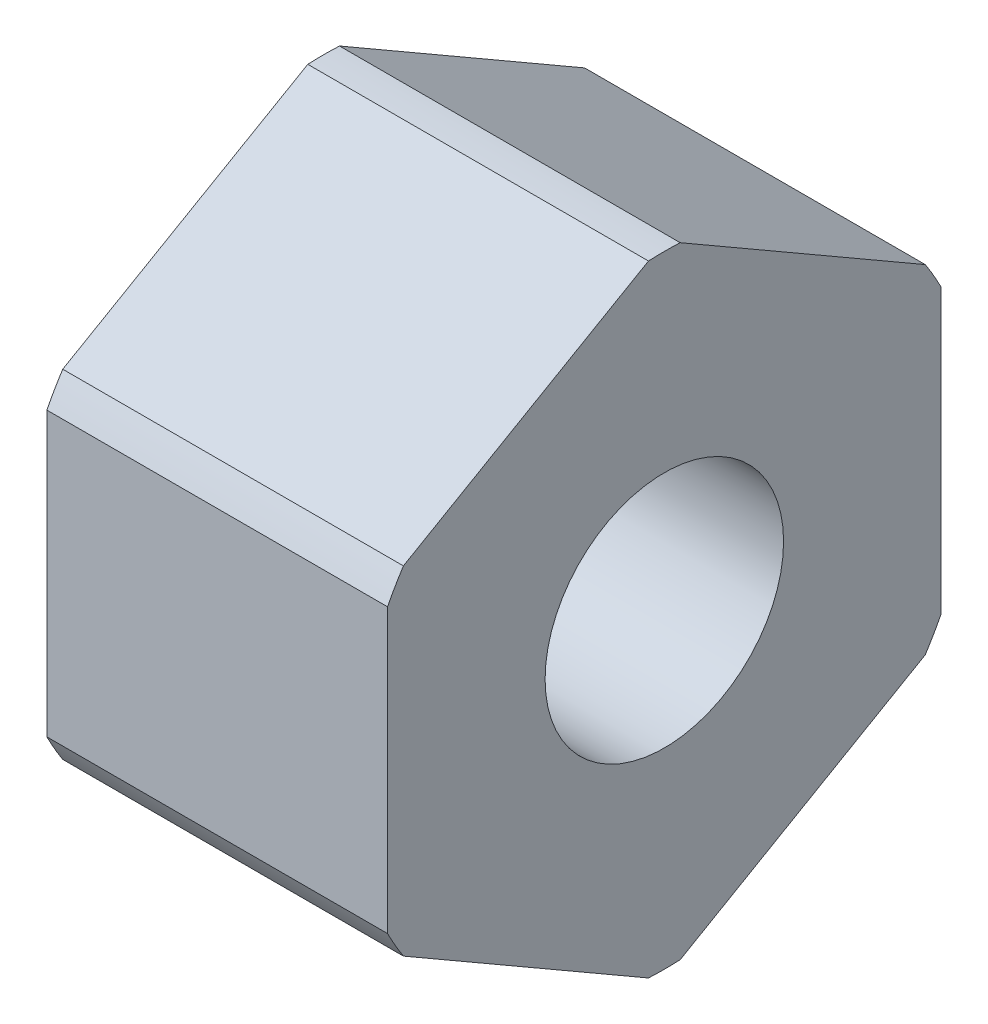
ISO-10303-21;
HEADER;
FILE_DESCRIPTION(('STEP AP214'),'2;1');
FILE_NAME('part.step','',(''),(''),'','','');
FILE_SCHEMA(('AUTOMOTIVE_DESIGN { 1 0 10303 214 1 1 1 1 }'));
ENDSEC;
DATA;
#1=APPLICATION_CONTEXT('core data for automotive mechanical design processes');
#2=APPLICATION_PROTOCOL_DEFINITION('international standard','automotive_design',2000,#1);
#3=PRODUCT_CONTEXT('',#1,'mechanical');
#4=PRODUCT('Part','Part','',(#3));
#5=PRODUCT_RELATED_PRODUCT_CATEGORY('part','',(#4));
#6=PRODUCT_DEFINITION_FORMATION('','',#4);
#7=PRODUCT_DEFINITION_CONTEXT('part definition',#1,'design');
#8=PRODUCT_DEFINITION('design','',#6,#7);
#9=PRODUCT_DEFINITION_SHAPE('','',#8);
#10=(LENGTH_UNIT() NAMED_UNIT(*) SI_UNIT(.MILLI.,.METRE.));
#11=(NAMED_UNIT(*) PLANE_ANGLE_UNIT() SI_UNIT($,.RADIAN.));
#12=(NAMED_UNIT(*) SI_UNIT($,.STERADIAN.) SOLID_ANGLE_UNIT());
#13=UNCERTAINTY_MEASURE_WITH_UNIT(LENGTH_MEASURE(1.E-05),#10,'distance_accuracy_value','');
#14=(GEOMETRIC_REPRESENTATION_CONTEXT(3) GLOBAL_UNCERTAINTY_ASSIGNED_CONTEXT((#13)) GLOBAL_UNIT_ASSIGNED_CONTEXT((#10,
#11,#12)) REPRESENTATION_CONTEXT('',''));
#15=CARTESIAN_POINT('',(0.,0.,0.));
#16=DIRECTION('',(0.,0.,1.));
#17=DIRECTION('',(1.,0.,0.));
#18=AXIS2_PLACEMENT_3D('',#15,#16,#17);
#19=CARTESIAN_POINT('',(0.,1.4,0.));
#20=DIRECTION('',(-1.,0.,0.));
#21=DIRECTION('',(0.,0.,1.));
#22=AXIS2_PLACEMENT_3D('',#19,#20,#21);
#23=PLANE('',#22);
#24=CARTESIAN_POINT('',(0.,0.,0.));
#25=DIRECTION('',(-1.,0.,0.));
#26=DIRECTION('',(0.,0.,1.));
#27=AXIS2_PLACEMENT_3D('',#24,#25,#26);
#28=CIRCLE('',#27,1.4);
#29=CARTESIAN_POINT('',(0.,0.,1.4));
#30=VERTEX_POINT('',#29);
#31=EDGE_CURVE('E136',#30,#30,#28,.T.);
#32=ORIENTED_EDGE('',*,*,#31,.T.);
#33=EDGE_LOOP('',(#32));
#34=FACE_BOUND('',#33,.T.);
#35=DIRECTION('',(0.,0.5,-0.866025403784439));
#36=VECTOR('',#35,1.);
#37=CARTESIAN_POINT('',(0.,3.16458256229943,1.01878221735089));
#38=LINE('',#37,#36);
#39=CARTESIAN_POINT('',(0.,1.98392017600762,3.06374945699382));
#40=VERTEX_POINT('',#39);
#41=CARTESIAN_POINT('',(0.,3.64524494859123,0.186250543006183));
#42=VERTEX_POINT('',#41);
#43=EDGE_CURVE('E202',#40,#42,#38,.T.);
#44=ORIENTED_EDGE('',*,*,#43,.F.);
#45=CARTESIAN_POINT('',(0.,0.,0.));
#46=DIRECTION('',(-1.,0.,0.));
#47=DIRECTION('',(0.,0.,1.));
#48=AXIS2_PLACEMENT_3D('',#45,#46,#47);
#49=CIRCLE('',#48,3.65);
#50=CARTESIAN_POINT('',(0.,1.66132477258362,3.25));
#51=VERTEX_POINT('',#50);
#52=EDGE_CURVE('E161',#51,#40,#49,.T.);
#53=ORIENTED_EDGE('',*,*,#52,.F.);
#54=DIRECTION('',(0.,1.,0.));
#55=VECTOR('',#54,1.);
#56=CARTESIAN_POINT('',(0.,1.4,3.25));
#57=LINE('',#56,#55);
#58=CARTESIAN_POINT('',(0.,-1.66132477258362,3.25));
#59=VERTEX_POINT('',#58);
#60=EDGE_CURVE('E185',#59,#51,#57,.T.);
#61=ORIENTED_EDGE('',*,*,#60,.F.);
#62=CARTESIAN_POINT('',(0.,-1.98392017600762,3.06374945699382));
#63=VERTEX_POINT('',#62);
#64=EDGE_CURVE('E154',#63,#59,#49,.T.);
#65=ORIENTED_EDGE('',*,*,#64,.F.);
#66=DIRECTION('',(0.,0.5,0.866025403784439));
#67=VECTOR('',#66,1.);
#68=CARTESIAN_POINT('',(0.,-2.46458256229942,2.23121778264911));
#69=LINE('',#68,#67);
#70=CARTESIAN_POINT('',(0.,-3.64524494859123,0.186250543006183));
#71=VERTEX_POINT('',#70);
#72=EDGE_CURVE('E209',#71,#63,#69,.T.);
#73=ORIENTED_EDGE('',*,*,#72,.F.);
#74=CARTESIAN_POINT('',(0.,-3.64524494859123,-0.186250543006181));
#75=VERTEX_POINT('',#74);
#76=EDGE_CURVE('E237',#75,#71,#49,.T.);
#77=ORIENTED_EDGE('',*,*,#76,.F.);
#78=DIRECTION('',(0.,-0.5,0.866025403784439));
#79=VECTOR('',#78,1.);
#80=CARTESIAN_POINT('',(0.,-2.46458256229943,-2.23121778264911));
#81=LINE('',#80,#79);
#82=CARTESIAN_POINT('',(0.,-1.98392017600762,-3.06374945699381));
#83=VERTEX_POINT('',#82);
#84=EDGE_CURVE('E214',#83,#75,#81,.T.);
#85=ORIENTED_EDGE('',*,*,#84,.F.);
#86=CARTESIAN_POINT('',(0.,-1.66132477258362,-3.25));
#87=VERTEX_POINT('',#86);
#88=EDGE_CURVE('E235',#87,#83,#49,.T.);
#89=ORIENTED_EDGE('',*,*,#88,.F.);
#90=DIRECTION('',(0.,-1.,0.));
#91=VECTOR('',#90,1.);
#92=CARTESIAN_POINT('',(0.,1.4,-3.25));
#93=LINE('',#92,#91);
#94=CARTESIAN_POINT('',(0.,1.66132477258362,-3.25));
#95=VERTEX_POINT('',#94);
#96=EDGE_CURVE('E220',#95,#87,#93,.T.);
#97=ORIENTED_EDGE('',*,*,#96,.F.);
#98=CARTESIAN_POINT('',(0.,1.98392017600762,-3.06374945699382));
#99=VERTEX_POINT('',#98);
#100=EDGE_CURVE('E231',#99,#95,#49,.T.);
#101=ORIENTED_EDGE('',*,*,#100,.F.);
#102=DIRECTION('',(0.,-0.5,-0.866025403784439));
#103=VECTOR('',#102,1.);
#104=CARTESIAN_POINT('',(0.,3.16458256229943,-1.01878221735089));
#105=LINE('',#104,#103);
#106=CARTESIAN_POINT('',(0.,3.64524494859123,-0.186250543006185));
#107=VERTEX_POINT('',#106);
#108=EDGE_CURVE('E146',#107,#99,#105,.T.);
#109=ORIENTED_EDGE('',*,*,#108,.F.);
#110=EDGE_CURVE('E145',#42,#107,#49,.T.);
#111=ORIENTED_EDGE('',*,*,#110,.F.);
#112=EDGE_LOOP('',(#44,#53,#61,#65,#73,#77,#85,#89,#97,#101,#109,#111));
#113=FACE_BOUND('',#112,.T.);
#114=ADVANCED_FACE('F37',(#34,#113),#23,.F.);
#115=CARTESIAN_POINT('',(-9.40540540540541,0.,0.));
#116=DIRECTION('',(-1.,0.,0.));
#117=DIRECTION('',(0.,0.,1.));
#118=AXIS2_PLACEMENT_3D('',#115,#116,#117);
#119=CYLINDRICAL_SURFACE('',#118,3.65);
#120=DIRECTION('',(-1.,0.,0.));
#121=VECTOR('',#120,1.);
#122=CARTESIAN_POINT('',(-9.40540540540541,3.64524494859123,0.186250543006181));
#123=LINE('',#122,#121);
#124=CARTESIAN_POINT('',(-4.,3.64524494859123,0.186250543006182));
#125=VERTEX_POINT('',#124);
#126=EDGE_CURVE('E198',#42,#125,#123,.T.);
#127=ORIENTED_EDGE('',*,*,#126,.F.);
#128=ORIENTED_EDGE('',*,*,#110,.T.);
#129=DIRECTION('',(-1.,0.,0.));
#130=VECTOR('',#129,1.);
#131=CARTESIAN_POINT('',(-9.40540540540541,3.64524494859123,-0.186250543006185));
#132=LINE('',#131,#130);
#133=CARTESIAN_POINT('',(-4.,3.64524494859123,-0.186250543006186));
#134=VERTEX_POINT('',#133);
#135=EDGE_CURVE('E127',#134,#107,#132,.F.);
#136=ORIENTED_EDGE('',*,*,#135,.F.);
#137=CARTESIAN_POINT('',(-4.,0.,0.));
#138=DIRECTION('',(-1.,0.,0.));
#139=DIRECTION('',(0.,0.,1.));
#140=AXIS2_PLACEMENT_3D('',#137,#138,#139);
#141=CIRCLE('',#140,3.65);
#142=EDGE_CURVE('E143',#125,#134,#141,.T.);
#143=ORIENTED_EDGE('',*,*,#142,.F.);
#144=EDGE_LOOP('',(#127,#128,#136,#143));
#145=FACE_BOUND('',#144,.T.);
#146=ADVANCED_FACE('F142',(#145),#119,.T.);
#147=DIRECTION('',(-1.,0.,0.));
#148=VECTOR('',#147,1.);
#149=CARTESIAN_POINT('',(-9.40540540540541,1.98392017600762,3.06374945699382));
#150=LINE('',#149,#148);
#151=CARTESIAN_POINT('',(-4.,1.98392017600762,3.06374945699381));
#152=VERTEX_POINT('',#151);
#153=EDGE_CURVE('E204',#152,#40,#150,.F.);
#154=ORIENTED_EDGE('',*,*,#153,.F.);
#155=CARTESIAN_POINT('',(-4.,1.66132477258362,3.25));
#156=VERTEX_POINT('',#155);
#157=EDGE_CURVE('E151',#156,#152,#141,.T.);
#158=ORIENTED_EDGE('',*,*,#157,.F.);
#159=DIRECTION('',(-1.,0.,0.));
#160=VECTOR('',#159,1.);
#161=CARTESIAN_POINT('',(-9.40540540540541,1.66132477258362,3.25));
#162=LINE('',#161,#160);
#163=EDGE_CURVE('E177',#51,#156,#162,.T.);
#164=ORIENTED_EDGE('',*,*,#163,.F.);
#165=ORIENTED_EDGE('',*,*,#52,.T.);
#166=EDGE_LOOP('',(#154,#158,#164,#165));
#167=FACE_BOUND('',#166,.T.);
#168=ADVANCED_FACE('F266',(#167),#119,.T.);
#169=DIRECTION('',(-1.,0.,0.));
#170=VECTOR('',#169,1.);
#171=CARTESIAN_POINT('',(-9.40540540540541,-1.66132477258362,3.25));
#172=LINE('',#171,#170);
#173=CARTESIAN_POINT('',(-4.,-1.66132477258362,3.25));
#174=VERTEX_POINT('',#173);
#175=EDGE_CURVE('E174',#174,#59,#172,.F.);
#176=ORIENTED_EDGE('',*,*,#175,.F.);
#177=CARTESIAN_POINT('',(-4.,-1.98392017600762,3.06374945699382));
#178=VERTEX_POINT('',#177);
#179=EDGE_CURVE('E155',#178,#174,#141,.T.);
#180=ORIENTED_EDGE('',*,*,#179,.F.);
#181=DIRECTION('',(-1.,0.,0.));
#182=VECTOR('',#181,1.);
#183=CARTESIAN_POINT('',(-9.40540540540541,-1.98392017600762,3.06374945699382));
#184=LINE('',#183,#182);
#185=EDGE_CURVE('E52',#63,#178,#184,.T.);
#186=ORIENTED_EDGE('',*,*,#185,.F.);
#187=ORIENTED_EDGE('',*,*,#64,.T.);
#188=EDGE_LOOP('',(#176,#180,#186,#187));
#189=FACE_BOUND('',#188,.T.);
#190=ADVANCED_FACE('F183',(#189),#119,.T.);
#191=DIRECTION('',(-1.,0.,0.));
#192=VECTOR('',#191,1.);
#193=CARTESIAN_POINT('',(-9.40540540540541,-3.64524494859123,0.186250543006183));
#194=LINE('',#193,#192);
#195=CARTESIAN_POINT('',(-4.,-3.64524494859123,0.186250543006185));
#196=VERTEX_POINT('',#195);
#197=EDGE_CURVE('E211',#196,#71,#194,.F.);
#198=ORIENTED_EDGE('',*,*,#197,.F.);
#199=CARTESIAN_POINT('',(-4.,-3.64524494859123,-0.186250543006183));
#200=VERTEX_POINT('',#199);
#201=EDGE_CURVE('E188',#200,#196,#141,.T.);
#202=ORIENTED_EDGE('',*,*,#201,.F.);
#203=DIRECTION('',(-1.,0.,0.));
#204=VECTOR('',#203,1.);
#205=CARTESIAN_POINT('',(-9.40540540540541,-3.64524494859123,-0.186250543006185));
#206=LINE('',#205,#204);
#207=EDGE_CURVE('E60',#75,#200,#206,.T.);
#208=ORIENTED_EDGE('',*,*,#207,.F.);
#209=ORIENTED_EDGE('',*,*,#76,.T.);
#210=EDGE_LOOP('',(#198,#202,#208,#209));
#211=FACE_BOUND('',#210,.T.);
#212=ADVANCED_FACE('F245',(#211),#119,.T.);
#213=DIRECTION('',(-1.,0.,0.));
#214=VECTOR('',#213,1.);
#215=CARTESIAN_POINT('',(-9.40540540540541,-1.98392017600762,-3.06374945699381));
#216=LINE('',#215,#214);
#217=CARTESIAN_POINT('',(-4.,-1.98392017600762,-3.06374945699382));
#218=VERTEX_POINT('',#217);
#219=EDGE_CURVE('E216',#218,#83,#216,.F.);
#220=ORIENTED_EDGE('',*,*,#219,.F.);
#221=CARTESIAN_POINT('',(-4.,-1.66132477258362,-3.25));
#222=VERTEX_POINT('',#221);
#223=EDGE_CURVE('E156',#222,#218,#141,.T.);
#224=ORIENTED_EDGE('',*,*,#223,.F.);
#225=DIRECTION('',(-1.,0.,0.));
#226=VECTOR('',#225,1.);
#227=CARTESIAN_POINT('',(-9.40540540540541,-1.66132477258362,-3.25));
#228=LINE('',#227,#226);
#229=EDGE_CURVE('E218',#87,#222,#228,.T.);
#230=ORIENTED_EDGE('',*,*,#229,.F.);
#231=ORIENTED_EDGE('',*,*,#88,.T.);
#232=EDGE_LOOP('',(#220,#224,#230,#231));
#233=FACE_BOUND('',#232,.T.);
#234=ADVANCED_FACE('F292',(#233),#119,.T.);
#235=DIRECTION('',(-1.,0.,0.));
#236=VECTOR('',#235,1.);
#237=CARTESIAN_POINT('',(-9.40540540540541,1.66132477258362,-3.25));
#238=LINE('',#237,#236);
#239=CARTESIAN_POINT('',(-4.,1.66132477258361,-3.25));
#240=VERTEX_POINT('',#239);
#241=EDGE_CURVE('E222',#240,#95,#238,.F.);
#242=ORIENTED_EDGE('',*,*,#241,.F.);
#243=CARTESIAN_POINT('',(-4.,1.98392017600762,-3.06374945699382));
#244=VERTEX_POINT('',#243);
#245=EDGE_CURVE('E152',#244,#240,#141,.T.);
#246=ORIENTED_EDGE('',*,*,#245,.F.);
#247=DIRECTION('',(-1.,0.,0.));
#248=VECTOR('',#247,1.);
#249=CARTESIAN_POINT('',(-9.40540540540541,1.98392017600762,-3.06374945699382));
#250=LINE('',#249,#248);
#251=EDGE_CURVE('E130',#99,#244,#250,.T.);
#252=ORIENTED_EDGE('',*,*,#251,.F.);
#253=ORIENTED_EDGE('',*,*,#100,.T.);
#254=EDGE_LOOP('',(#242,#246,#252,#253));
#255=FACE_BOUND('',#254,.T.);
#256=ADVANCED_FACE('F230',(#255),#119,.T.);
#257=CARTESIAN_POINT('',(-4.,3.65,0.));
#258=DIRECTION('',(1.,0.,0.));
#259=DIRECTION('',(0.,0.,-1.));
#260=AXIS2_PLACEMENT_3D('',#257,#258,#259);
#261=PLANE('',#260);
#262=CARTESIAN_POINT('',(-4.,0.,0.));
#263=DIRECTION('',(-1.,0.,0.));
#264=DIRECTION('',(0.,0.,1.));
#265=AXIS2_PLACEMENT_3D('',#262,#263,#264);
#266=CIRCLE('',#265,2.1);
#267=CARTESIAN_POINT('',(-4.,0.,2.1));
#268=VERTEX_POINT('',#267);
#269=EDGE_CURVE('E159',#268,#268,#266,.T.);
#270=ORIENTED_EDGE('',*,*,#269,.F.);
#271=EDGE_LOOP('',(#270));
#272=FACE_BOUND('',#271,.T.);
#273=DIRECTION('',(0.,-0.5,0.866025403784439));
#274=VECTOR('',#273,1.);
#275=CARTESIAN_POINT('',(-4.,3.72708256229942,0.044503638093399));
#276=LINE('',#275,#274);
#277=EDGE_CURVE('E12',#125,#152,#276,.T.);
#278=ORIENTED_EDGE('',*,*,#277,.F.);
#279=ORIENTED_EDGE('',*,*,#142,.T.);
#280=DIRECTION('',(0.,0.5,0.866025403784439));
#281=VECTOR('',#280,1.);
#282=CARTESIAN_POINT('',(-4.,3.72708256229943,-0.0445036380933998));
#283=LINE('',#282,#281);
#284=EDGE_CURVE('E124',#244,#134,#283,.T.);
#285=ORIENTED_EDGE('',*,*,#284,.F.);
#286=ORIENTED_EDGE('',*,*,#245,.T.);
#287=DIRECTION('',(0.,1.,0.));
#288=VECTOR('',#287,1.);
#289=CARTESIAN_POINT('',(-4.,3.65,-3.25));
#290=LINE('',#289,#288);
#291=EDGE_CURVE('E135',#222,#240,#290,.T.);
#292=ORIENTED_EDGE('',*,*,#291,.F.);
#293=ORIENTED_EDGE('',*,*,#223,.T.);
#294=DIRECTION('',(0.,0.5,-0.866025403784439));
#295=VECTOR('',#294,1.);
#296=CARTESIAN_POINT('',(-4.,-1.90208256229943,-3.2054963619066));
#297=LINE('',#296,#295);
#298=EDGE_CURVE('E167',#200,#218,#297,.T.);
#299=ORIENTED_EDGE('',*,*,#298,.F.);
#300=ORIENTED_EDGE('',*,*,#201,.T.);
#301=DIRECTION('',(0.,-0.5,-0.866025403784439));
#302=VECTOR('',#301,1.);
#303=CARTESIAN_POINT('',(-4.,-1.90208256229943,3.2054963619066));
#304=LINE('',#303,#302);
#305=EDGE_CURVE('E169',#178,#196,#304,.T.);
#306=ORIENTED_EDGE('',*,*,#305,.F.);
#307=ORIENTED_EDGE('',*,*,#179,.T.);
#308=DIRECTION('',(0.,-1.,0.));
#309=VECTOR('',#308,1.);
#310=CARTESIAN_POINT('',(-4.,3.65,3.25));
#311=LINE('',#310,#309);
#312=EDGE_CURVE('E45',#156,#174,#311,.T.);
#313=ORIENTED_EDGE('',*,*,#312,.F.);
#314=ORIENTED_EDGE('',*,*,#157,.T.);
#315=EDGE_LOOP('',(#278,#279,#285,#286,#292,#293,#299,#300,#306,#307,#313,#314));
#316=FACE_BOUND('',#315,.T.);
#317=ADVANCED_FACE('F149',(#272,#316),#261,.F.);
#318=CARTESIAN_POINT('',(-9.40540540540541,0.,0.));
#319=DIRECTION('',(-1.,0.,0.));
#320=DIRECTION('',(0.,0.,1.));
#321=AXIS2_PLACEMENT_3D('',#318,#319,#320);
#322=CYLINDRICAL_SURFACE('',#321,1.4);
#323=ORIENTED_EDGE('',*,*,#31,.F.);
#324=EDGE_LOOP('',(#323));
#325=FACE_BOUND('',#324,.T.);
#326=CARTESIAN_POINT('',(-3.,0.,0.));
#327=DIRECTION('',(-1.,0.,0.));
#328=DIRECTION('',(0.,0.,1.));
#329=AXIS2_PLACEMENT_3D('',#326,#327,#328);
#330=CIRCLE('',#329,1.4);
#331=CARTESIAN_POINT('',(-3.,0.,1.4));
#332=VERTEX_POINT('',#331);
#333=EDGE_CURVE('E194',#332,#332,#330,.T.);
#334=ORIENTED_EDGE('',*,*,#333,.T.);
#335=EDGE_LOOP('',(#334));
#336=FACE_BOUND('',#335,.T.);
#337=ADVANCED_FACE('F39',(#325,#336),#322,.F.);
#338=CARTESIAN_POINT('',(-9.40540540540541,0.,0.));
#339=DIRECTION('',(-1.,0.,0.));
#340=DIRECTION('',(0.,0.,1.));
#341=AXIS2_PLACEMENT_3D('',#338,#339,#340);
#342=CYLINDRICAL_SURFACE('',#341,2.1);
#343=CARTESIAN_POINT('',(-3.,0.,0.));
#344=DIRECTION('',(-1.,0.,0.));
#345=DIRECTION('',(0.,0.,1.));
#346=AXIS2_PLACEMENT_3D('',#343,#344,#345);
#347=CIRCLE('',#346,2.1);
#348=CARTESIAN_POINT('',(-3.,0.,2.1));
#349=VERTEX_POINT('',#348);
#350=EDGE_CURVE('E190',#349,#349,#347,.T.);
#351=ORIENTED_EDGE('',*,*,#350,.F.);
#352=EDGE_LOOP('',(#351));
#353=FACE_BOUND('',#352,.T.);
#354=ORIENTED_EDGE('',*,*,#269,.T.);
#355=EDGE_LOOP('',(#354));
#356=FACE_BOUND('',#355,.T.);
#357=ADVANCED_FACE('F272',(#353,#356),#342,.F.);
#358=CARTESIAN_POINT('',(-3.,2.1,0.));
#359=DIRECTION('',(1.,0.,0.));
#360=DIRECTION('',(0.,0.,-1.));
#361=AXIS2_PLACEMENT_3D('',#358,#359,#360);
#362=PLANE('',#361);
#363=ORIENTED_EDGE('',*,*,#333,.F.);
#364=EDGE_LOOP('',(#363));
#365=FACE_BOUND('',#364,.T.);
#366=ORIENTED_EDGE('',*,*,#350,.T.);
#367=EDGE_LOOP('',(#366));
#368=FACE_BOUND('',#367,.T.);
#369=ADVANCED_FACE('F275',(#365,#368),#362,.F.);
#370=CARTESIAN_POINT('',(6.,3.75277674973257,0.));
#371=DIRECTION('',(0.,0.866025403784439,-0.5));
#372=DIRECTION('',(0.,0.5,0.866025403784439));
#373=AXIS2_PLACEMENT_3D('',#370,#371,#372);
#374=PLANE('',#373);
#375=ORIENTED_EDGE('',*,*,#251,.T.);
#376=ORIENTED_EDGE('',*,*,#284,.T.);
#377=ORIENTED_EDGE('',*,*,#135,.T.);
#378=ORIENTED_EDGE('',*,*,#108,.T.);
#379=EDGE_LOOP('',(#375,#376,#377,#378));
#380=FACE_BOUND('',#379,.T.);
#381=ADVANCED_FACE('F126',(#380),#374,.T.);
#382=CARTESIAN_POINT('',(6.,1.87638837486628,-3.25));
#383=DIRECTION('',(0.,0.,-1.));
#384=DIRECTION('',(0.,1.,0.));
#385=AXIS2_PLACEMENT_3D('',#382,#383,#384);
#386=PLANE('',#385);
#387=ORIENTED_EDGE('',*,*,#229,.T.);
#388=ORIENTED_EDGE('',*,*,#291,.T.);
#389=ORIENTED_EDGE('',*,*,#241,.T.);
#390=ORIENTED_EDGE('',*,*,#96,.T.);
#391=EDGE_LOOP('',(#387,#388,#389,#390));
#392=FACE_BOUND('',#391,.T.);
#393=ADVANCED_FACE('F259',(#392),#386,.T.);
#394=CARTESIAN_POINT('',(6.,-1.87638837486628,-3.25));
#395=DIRECTION('',(0.,-0.866025403784439,-0.5));
#396=DIRECTION('',(0.,0.5,-0.866025403784439));
#397=AXIS2_PLACEMENT_3D('',#394,#395,#396);
#398=PLANE('',#397);
#399=ORIENTED_EDGE('',*,*,#207,.T.);
#400=ORIENTED_EDGE('',*,*,#298,.T.);
#401=ORIENTED_EDGE('',*,*,#219,.T.);
#402=ORIENTED_EDGE('',*,*,#84,.T.);
#403=EDGE_LOOP('',(#399,#400,#401,#402));
#404=FACE_BOUND('',#403,.T.);
#405=ADVANCED_FACE('F251',(#404),#398,.T.);
#406=CARTESIAN_POINT('',(6.,-3.75277674973257,0.));
#407=DIRECTION('',(0.,-0.866025403784439,0.5));
#408=DIRECTION('',(0.,-0.5,-0.866025403784439));
#409=AXIS2_PLACEMENT_3D('',#406,#407,#408);
#410=PLANE('',#409);
#411=ORIENTED_EDGE('',*,*,#185,.T.);
#412=ORIENTED_EDGE('',*,*,#305,.T.);
#413=ORIENTED_EDGE('',*,*,#197,.T.);
#414=ORIENTED_EDGE('',*,*,#72,.T.);
#415=EDGE_LOOP('',(#411,#412,#413,#414));
#416=FACE_BOUND('',#415,.T.);
#417=ADVANCED_FACE('F249',(#416),#410,.T.);
#418=CARTESIAN_POINT('',(6.,-1.87638837486628,3.25));
#419=DIRECTION('',(0.,0.,1.));
#420=DIRECTION('',(0.,-1.,0.));
#421=AXIS2_PLACEMENT_3D('',#418,#419,#420);
#422=PLANE('',#421);
#423=ORIENTED_EDGE('',*,*,#163,.T.);
#424=ORIENTED_EDGE('',*,*,#312,.T.);
#425=ORIENTED_EDGE('',*,*,#175,.T.);
#426=ORIENTED_EDGE('',*,*,#60,.T.);
#427=EDGE_LOOP('',(#423,#424,#425,#426));
#428=FACE_BOUND('',#427,.T.);
#429=ADVANCED_FACE('F173',(#428),#422,.T.);
#430=CARTESIAN_POINT('',(6.,1.87638837486629,3.25));
#431=DIRECTION('',(0.,0.866025403784439,0.5));
#432=DIRECTION('',(0.,-0.5,0.866025403784439));
#433=AXIS2_PLACEMENT_3D('',#430,#431,#432);
#434=PLANE('',#433);
#435=ORIENTED_EDGE('',*,*,#126,.T.);
#436=ORIENTED_EDGE('',*,*,#277,.T.);
#437=ORIENTED_EDGE('',*,*,#153,.T.);
#438=ORIENTED_EDGE('',*,*,#43,.T.);
#439=EDGE_LOOP('',(#435,#436,#437,#438));
#440=FACE_BOUND('',#439,.T.);
#441=ADVANCED_FACE('F257',(#440),#434,.T.);
#442=CLOSED_SHELL('',(#114,#146,#168,#190,#212,#234,#256,#317,#337,#357,#369,#381,#393,#405,
#417,#429,#441));
#443=MANIFOLD_SOLID_BREP('B2',#442);
#444=ADVANCED_BREP_SHAPE_REPRESENTATION('',(#18,#443),#14);
#445=SHAPE_DEFINITION_REPRESENTATION(#9,#444);
ENDSEC;
END-ISO-10303-21;
